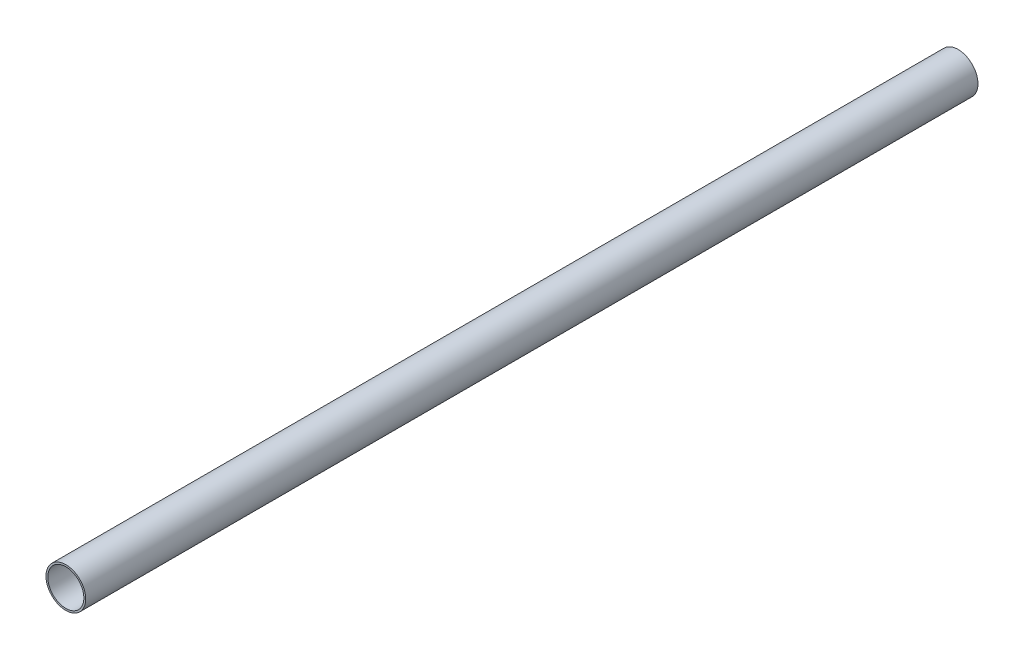
ISO-10303-21;
HEADER;
FILE_DESCRIPTION(('STEP AP214'),'2;1');
FILE_NAME('part.step','',(''),(''),'','','');
FILE_SCHEMA(('AUTOMOTIVE_DESIGN { 1 0 10303 214 1 1 1 1 }'));
ENDSEC;
DATA;
#1=APPLICATION_CONTEXT('core data for automotive mechanical design processes');
#2=APPLICATION_PROTOCOL_DEFINITION('international standard','automotive_design',2000,#1);
#3=PRODUCT_CONTEXT('',#1,'mechanical');
#4=PRODUCT('Part','Part','',(#3));
#5=PRODUCT_RELATED_PRODUCT_CATEGORY('part','',(#4));
#6=PRODUCT_DEFINITION_FORMATION('','',#4);
#7=PRODUCT_DEFINITION_CONTEXT('part definition',#1,'design');
#8=PRODUCT_DEFINITION('design','',#6,#7);
#9=PRODUCT_DEFINITION_SHAPE('','',#8);
#10=(LENGTH_UNIT() NAMED_UNIT(*) SI_UNIT(.MILLI.,.METRE.));
#11=(NAMED_UNIT(*) PLANE_ANGLE_UNIT() SI_UNIT($,.RADIAN.));
#12=(NAMED_UNIT(*) SI_UNIT($,.STERADIAN.) SOLID_ANGLE_UNIT());
#13=UNCERTAINTY_MEASURE_WITH_UNIT(LENGTH_MEASURE(1.E-05),#10,'distance_accuracy_value','');
#14=(GEOMETRIC_REPRESENTATION_CONTEXT(3) GLOBAL_UNCERTAINTY_ASSIGNED_CONTEXT((#13)) GLOBAL_UNIT_ASSIGNED_CONTEXT((#10,
#11,#12)) REPRESENTATION_CONTEXT('',''));
#15=CARTESIAN_POINT('',(0.,0.,0.));
#16=DIRECTION('',(0.,0.,1.));
#17=DIRECTION('',(1.,0.,0.));
#18=AXIS2_PLACEMENT_3D('',#15,#16,#17);
#19=CARTESIAN_POINT('',(2675.10583961434,3025.34596438199,174.625));
#20=DIRECTION('',(0.,0.,1.));
#21=DIRECTION('',(1.,0.,0.));
#22=AXIS2_PLACEMENT_3D('',#19,#20,#21);
#23=PLANE('',#22);
#24=CARTESIAN_POINT('',(2675.10583961434,3025.34596438199,174.625));
#25=DIRECTION('',(0.,0.,1.));
#26=DIRECTION('',(1.,0.,0.));
#27=AXIS2_PLACEMENT_3D('',#24,#25,#26);
#28=CIRCLE('',#27,3.88620000000017);
#29=CARTESIAN_POINT('',(2678.99203961434,3025.34596438199,174.625));
#30=VERTEX_POINT('',#29);
#31=EDGE_CURVE('E10',#30,#30,#28,.T.);
#32=ORIENTED_EDGE('',*,*,#31,.T.);
#33=EDGE_LOOP('',(#32));
#34=FACE_BOUND('',#33,.T.);
#35=CARTESIAN_POINT('',(2675.10583961434,3025.34596438199,174.625));
#36=DIRECTION('',(0.,0.,1.));
#37=DIRECTION('',(1.,0.,0.));
#38=AXIS2_PLACEMENT_3D('',#35,#36,#37);
#39=CIRCLE('',#38,3.53059999999994);
#40=CARTESIAN_POINT('',(2678.63643961434,3025.34596438199,174.625));
#41=VERTEX_POINT('',#40);
#42=EDGE_CURVE('E42',#41,#41,#39,.T.);
#43=ORIENTED_EDGE('',*,*,#42,.F.);
#44=EDGE_LOOP('',(#43));
#45=FACE_BOUND('',#44,.T.);
#46=ADVANCED_FACE('F31',(#34,#45),#23,.T.);
#47=CARTESIAN_POINT('',(2675.10583961434,3025.34596438199,0.));
#48=DIRECTION('',(0.,0.,1.));
#49=DIRECTION('',(1.,0.,0.));
#50=AXIS2_PLACEMENT_3D('',#47,#48,#49);
#51=PLANE('',#50);
#52=CARTESIAN_POINT('',(2675.10583961434,3025.34596438199,0.));
#53=DIRECTION('',(0.,0.,1.));
#54=DIRECTION('',(1.,0.,0.));
#55=AXIS2_PLACEMENT_3D('',#52,#53,#54);
#56=CIRCLE('',#55,3.88620000000017);
#57=CARTESIAN_POINT('',(2678.99203961434,3025.34596438199,0.));
#58=VERTEX_POINT('',#57);
#59=EDGE_CURVE('E35',#58,#58,#56,.T.);
#60=ORIENTED_EDGE('',*,*,#59,.F.);
#61=EDGE_LOOP('',(#60));
#62=FACE_BOUND('',#61,.T.);
#63=CARTESIAN_POINT('',(2675.10583961434,3025.34596438199,0.));
#64=DIRECTION('',(0.,0.,1.));
#65=DIRECTION('',(1.,0.,0.));
#66=AXIS2_PLACEMENT_3D('',#63,#64,#65);
#67=CIRCLE('',#66,3.53059999999994);
#68=CARTESIAN_POINT('',(2678.63643961434,3025.34596438199,0.));
#69=VERTEX_POINT('',#68);
#70=EDGE_CURVE('E44',#69,#69,#67,.T.);
#71=ORIENTED_EDGE('',*,*,#70,.T.);
#72=EDGE_LOOP('',(#71));
#73=FACE_BOUND('',#72,.T.);
#74=ADVANCED_FACE('F54',(#62,#73),#51,.F.);
#75=CARTESIAN_POINT('',(2675.10583961434,3025.34596438199,174.625));
#76=DIRECTION('',(0.,0.,-1.));
#77=DIRECTION('',(-1.,0.,0.));
#78=AXIS2_PLACEMENT_3D('',#75,#76,#77);
#79=CYLINDRICAL_SURFACE('',#78,3.88620000000017);
#80=ORIENTED_EDGE('',*,*,#31,.F.);
#81=EDGE_LOOP('',(#80));
#82=FACE_BOUND('',#81,.T.);
#83=ORIENTED_EDGE('',*,*,#59,.T.);
#84=EDGE_LOOP('',(#83));
#85=FACE_BOUND('',#84,.T.);
#86=ADVANCED_FACE('F33',(#82,#85),#79,.T.);
#87=CARTESIAN_POINT('',(2675.10583961434,3025.34596438199,174.625));
#88=DIRECTION('',(0.,0.,-1.));
#89=DIRECTION('',(-1.,0.,0.));
#90=AXIS2_PLACEMENT_3D('',#87,#88,#89);
#91=CYLINDRICAL_SURFACE('',#90,3.53059999999994);
#92=ORIENTED_EDGE('',*,*,#42,.T.);
#93=EDGE_LOOP('',(#92));
#94=FACE_BOUND('',#93,.T.);
#95=ORIENTED_EDGE('',*,*,#70,.F.);
#96=EDGE_LOOP('',(#95));
#97=FACE_BOUND('',#96,.T.);
#98=ADVANCED_FACE('F50',(#94,#97),#91,.F.);
#99=CLOSED_SHELL('',(#46,#74,#86,#98));
#100=MANIFOLD_SOLID_BREP('B2',#99);
#101=ADVANCED_BREP_SHAPE_REPRESENTATION('',(#18,#100),#14);
#102=SHAPE_DEFINITION_REPRESENTATION(#9,#101);
ENDSEC;
END-ISO-10303-21;
